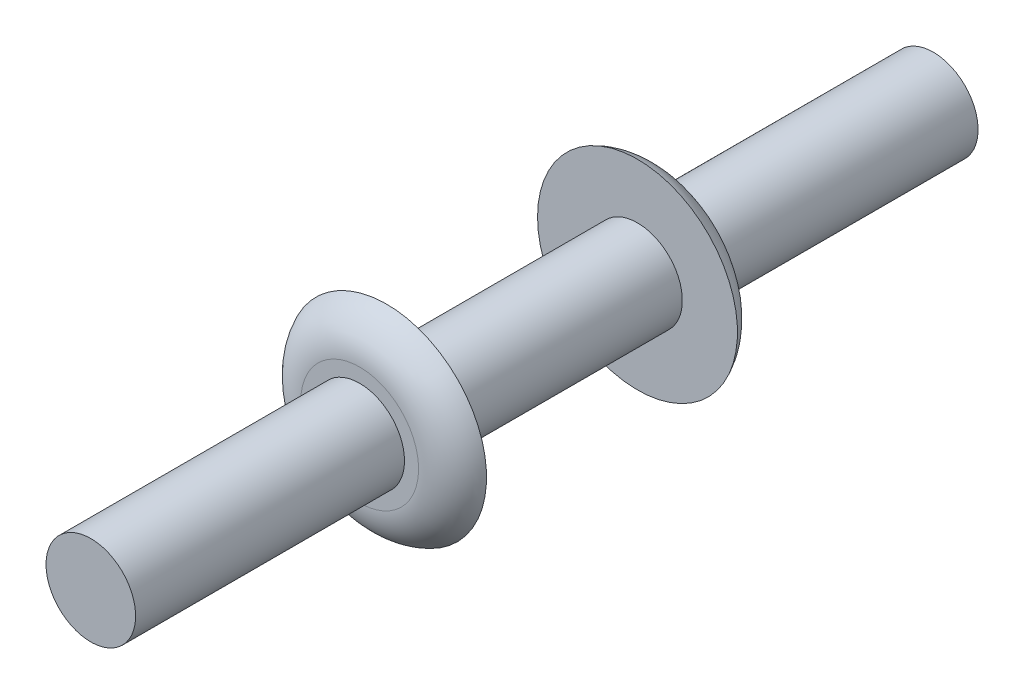
ISO-10303-21;
HEADER;
FILE_DESCRIPTION(('STEP AP214'),'2;1');
FILE_NAME('part.step','',(''),(''),'','','');
FILE_SCHEMA(('AUTOMOTIVE_DESIGN { 1 0 10303 214 1 1 1 1 }'));
ENDSEC;
DATA;
#1=APPLICATION_CONTEXT('core data for automotive mechanical design processes');
#2=APPLICATION_PROTOCOL_DEFINITION('international standard','automotive_design',2000,#1);
#3=PRODUCT_CONTEXT('',#1,'mechanical');
#4=PRODUCT('Part','Part','',(#3));
#5=PRODUCT_RELATED_PRODUCT_CATEGORY('part','',(#4));
#6=PRODUCT_DEFINITION_FORMATION('','',#4);
#7=PRODUCT_DEFINITION_CONTEXT('part definition',#1,'design');
#8=PRODUCT_DEFINITION('design','',#6,#7);
#9=PRODUCT_DEFINITION_SHAPE('','',#8);
#10=(LENGTH_UNIT() NAMED_UNIT(*) SI_UNIT(.MILLI.,.METRE.));
#11=(NAMED_UNIT(*) PLANE_ANGLE_UNIT() SI_UNIT($,.RADIAN.));
#12=(NAMED_UNIT(*) SI_UNIT($,.STERADIAN.) SOLID_ANGLE_UNIT());
#13=UNCERTAINTY_MEASURE_WITH_UNIT(LENGTH_MEASURE(1.E-05),#10,'distance_accuracy_value','');
#14=(GEOMETRIC_REPRESENTATION_CONTEXT(3) GLOBAL_UNCERTAINTY_ASSIGNED_CONTEXT((#13)) GLOBAL_UNIT_ASSIGNED_CONTEXT((#10,
#11,#12)) REPRESENTATION_CONTEXT('',''));
#15=CARTESIAN_POINT('',(0.,0.,0.));
#16=DIRECTION('',(0.,0.,1.));
#17=DIRECTION('',(1.,0.,0.));
#18=AXIS2_PLACEMENT_3D('',#15,#16,#17);
#19=CARTESIAN_POINT('',(-15.,0.,-209.43));
#20=DIRECTION('',(0.,0.,-1.));
#21=DIRECTION('',(-1.,0.,0.));
#22=AXIS2_PLACEMENT_3D('',#19,#20,#21);
#23=CYLINDRICAL_SURFACE('',#22,5.);
#24=CARTESIAN_POINT('',(-15.,0.,-245.43));
#25=DIRECTION('',(0.,0.,-1.));
#26=DIRECTION('',(-1.,0.,0.));
#27=AXIS2_PLACEMENT_3D('',#24,#25,#26);
#28=CIRCLE('',#27,5.);
#29=CARTESIAN_POINT('',(-20.,0.,-245.43));
#30=VERTEX_POINT('',#29);
#31=EDGE_CURVE('E56',#30,#30,#28,.T.);
#32=ORIENTED_EDGE('',*,*,#31,.F.);
#33=EDGE_LOOP('',(#32));
#34=FACE_BOUND('',#33,.T.);
#35=CARTESIAN_POINT('',(-15.,0.,-217.43));
#36=DIRECTION('',(0.,0.,1.));
#37=DIRECTION('',(1.,0.,0.));
#38=AXIS2_PLACEMENT_3D('',#35,#36,#37);
#39=CIRCLE('',#38,5.);
#40=CARTESIAN_POINT('',(-10.,0.,-217.43));
#41=VERTEX_POINT('',#40);
#42=EDGE_CURVE('E54',#41,#41,#39,.F.);
#43=ORIENTED_EDGE('',*,*,#42,.T.);
#44=EDGE_LOOP('',(#43));
#45=FACE_BOUND('',#44,.T.);
#46=ADVANCED_FACE('F35',(#34,#45),#23,.T.);
#47=CARTESIAN_POINT('',(-15.,0.,-248.43));
#48=DIRECTION('',(0.,0.,-1.));
#49=DIRECTION('',(-1.,0.,0.));
#50=AXIS2_PLACEMENT_3D('',#47,#48,#49);
#51=PLANE('',#50);
#52=CARTESIAN_POINT('',(-15.,0.,-248.43));
#53=DIRECTION('',(0.,0.,-1.));
#54=DIRECTION('',(-1.,0.,0.));
#55=AXIS2_PLACEMENT_3D('',#52,#53,#54);
#56=CIRCLE('',#55,5.);
#57=CARTESIAN_POINT('',(-20.,0.,-248.43));
#58=VERTEX_POINT('',#57);
#59=EDGE_CURVE('E61',#58,#58,#56,.T.);
#60=ORIENTED_EDGE('',*,*,#59,.F.);
#61=EDGE_LOOP('',(#60));
#62=FACE_BOUND('',#61,.T.);
#63=CARTESIAN_POINT('',(-15.,0.,-248.43));
#64=DIRECTION('',(0.,0.,-1.));
#65=DIRECTION('',(-1.,0.,0.));
#66=AXIS2_PLACEMENT_3D('',#63,#64,#65);
#67=CIRCLE('',#66,6.57134738170197);
#68=CARTESIAN_POINT('',(-21.571347381702,0.,-248.43));
#69=VERTEX_POINT('',#68);
#70=EDGE_CURVE('E42',#69,#69,#67,.T.);
#71=ORIENTED_EDGE('',*,*,#70,.T.);
#72=EDGE_LOOP('',(#71));
#73=FACE_BOUND('',#72,.T.);
#74=ADVANCED_FACE('F79',(#62,#73),#51,.T.);
#75=CARTESIAN_POINT('',(-15.,0.,-245.43));
#76=DIRECTION('',(0.,0.,-1.));
#77=DIRECTION('',(-1.,0.,0.));
#78=AXIS2_PLACEMENT_3D('',#75,#76,#77);
#79=PLANE('',#78);
#80=ORIENTED_EDGE('',*,*,#31,.T.);
#81=EDGE_LOOP('',(#80));
#82=FACE_BOUND('',#81,.T.);
#83=CARTESIAN_POINT('',(-15.,0.,-245.43));
#84=DIRECTION('',(0.,0.,-1.));
#85=DIRECTION('',(-1.,0.,0.));
#86=AXIS2_PLACEMENT_3D('',#83,#84,#85);
#87=CIRCLE('',#86,11.1539230766578);
#88=CARTESIAN_POINT('',(-26.1539230766578,0.,-245.43));
#89=VERTEX_POINT('',#88);
#90=EDGE_CURVE('E46',#89,#89,#87,.T.);
#91=ORIENTED_EDGE('',*,*,#90,.F.);
#92=EDGE_LOOP('',(#91));
#93=FACE_BOUND('',#92,.T.);
#94=ADVANCED_FACE('F81',(#82,#93),#79,.F.);
#95=CARTESIAN_POINT('',(-15.,0.,-243.43));
#96=DIRECTION('',(0.,0.,1.));
#97=DIRECTION('',(1.,0.,0.));
#98=AXIS2_PLACEMENT_3D('',#95,#96,#97);
#99=TOROIDAL_SURFACE('',#98,6.57134738170197,5.);
#100=ORIENTED_EDGE('',*,*,#90,.T.);
#101=EDGE_LOOP('',(#100));
#102=FACE_BOUND('',#101,.T.);
#103=ORIENTED_EDGE('',*,*,#70,.F.);
#104=EDGE_LOOP('',(#103));
#105=FACE_BOUND('',#104,.T.);
#106=ADVANCED_FACE('F37',(#102,#105),#99,.T.);
#107=CARTESIAN_POINT('',(-15.,0.,-278.43));
#108=DIRECTION('',(0.,0.,1.));
#109=DIRECTION('',(1.,0.,0.));
#110=AXIS2_PLACEMENT_3D('',#107,#108,#109);
#111=CYLINDRICAL_SURFACE('',#110,5.);
#112=CARTESIAN_POINT('',(-15.,0.,-278.43));
#113=DIRECTION('',(0.,0.,-1.));
#114=DIRECTION('',(-1.,0.,0.));
#115=AXIS2_PLACEMENT_3D('',#112,#113,#114);
#116=CIRCLE('',#115,5.);
#117=CARTESIAN_POINT('',(-20.,0.,-278.43));
#118=VERTEX_POINT('',#117);
#119=EDGE_CURVE('E51',#118,#118,#116,.T.);
#120=ORIENTED_EDGE('',*,*,#119,.F.);
#121=EDGE_LOOP('',(#120));
#122=FACE_BOUND('',#121,.T.);
#123=ORIENTED_EDGE('',*,*,#59,.T.);
#124=EDGE_LOOP('',(#123));
#125=FACE_BOUND('',#124,.T.);
#126=ADVANCED_FACE('F77',(#122,#125),#111,.T.);
#127=CARTESIAN_POINT('',(-15.,0.,-278.43));
#128=DIRECTION('',(0.,0.,-1.));
#129=DIRECTION('',(-1.,0.,0.));
#130=AXIS2_PLACEMENT_3D('',#127,#128,#129);
#131=PLANE('',#130);
#132=ORIENTED_EDGE('',*,*,#119,.T.);
#133=EDGE_LOOP('',(#132));
#134=FACE_BOUND('',#133,.T.);
#135=ADVANCED_FACE('F94',(#134),#131,.T.);
#136=CARTESIAN_POINT('',(-15.,0.,-214.43));
#137=DIRECTION('',(0.,0.,1.));
#138=DIRECTION('',(-1.,0.,0.));
#139=AXIS2_PLACEMENT_3D('',#136,#137,#138);
#140=PLANE('',#139);
#141=CARTESIAN_POINT('',(-15.,0.,-214.43));
#142=DIRECTION('',(0.,0.,1.));
#143=DIRECTION('',(1.,0.,0.));
#144=AXIS2_PLACEMENT_3D('',#141,#142,#143);
#145=CIRCLE('',#144,5.);
#146=CARTESIAN_POINT('',(-10.,0.,-214.43));
#147=VERTEX_POINT('',#146);
#148=EDGE_CURVE('E10',#147,#147,#145,.F.);
#149=ORIENTED_EDGE('',*,*,#148,.T.);
#150=EDGE_LOOP('',(#149));
#151=FACE_BOUND('',#150,.T.);
#152=CARTESIAN_POINT('',(-15.,0.,-214.43));
#153=DIRECTION('',(0.,0.,-1.));
#154=DIRECTION('',(-1.,0.,0.));
#155=AXIS2_PLACEMENT_3D('',#152,#153,#154);
#156=CIRCLE('',#155,6.57134738170197);
#157=CARTESIAN_POINT('',(-21.571347381702,0.,-214.43));
#158=VERTEX_POINT('',#157);
#159=EDGE_CURVE('E57',#158,#158,#156,.T.);
#160=ORIENTED_EDGE('',*,*,#159,.F.);
#161=EDGE_LOOP('',(#160));
#162=FACE_BOUND('',#161,.T.);
#163=ADVANCED_FACE('F97',(#151,#162),#140,.T.);
#164=CARTESIAN_POINT('',(-15.,0.,-217.43));
#165=DIRECTION('',(0.,0.,1.));
#166=DIRECTION('',(-1.,0.,0.));
#167=AXIS2_PLACEMENT_3D('',#164,#165,#166);
#168=PLANE('',#167);
#169=ORIENTED_EDGE('',*,*,#42,.F.);
#170=EDGE_LOOP('',(#169));
#171=FACE_BOUND('',#170,.T.);
#172=CARTESIAN_POINT('',(-15.,0.,-217.43));
#173=DIRECTION('',(0.,0.,-1.));
#174=DIRECTION('',(-1.,0.,0.));
#175=AXIS2_PLACEMENT_3D('',#172,#173,#174);
#176=CIRCLE('',#175,11.1539230766578);
#177=CARTESIAN_POINT('',(-26.1539230766578,0.,-217.43));
#178=VERTEX_POINT('',#177);
#179=EDGE_CURVE('E64',#178,#178,#176,.T.);
#180=ORIENTED_EDGE('',*,*,#179,.T.);
#181=EDGE_LOOP('',(#180));
#182=FACE_BOUND('',#181,.T.);
#183=ADVANCED_FACE('F106',(#171,#182),#168,.F.);
#184=CARTESIAN_POINT('',(-15.,0.,-219.43));
#185=DIRECTION('',(0.,0.,-1.));
#186=DIRECTION('',(1.,0.,0.));
#187=AXIS2_PLACEMENT_3D('',#184,#185,#186);
#188=TOROIDAL_SURFACE('',#187,6.57134738170197,5.);
#189=ORIENTED_EDGE('',*,*,#179,.F.);
#190=EDGE_LOOP('',(#189));
#191=FACE_BOUND('',#190,.T.);
#192=ORIENTED_EDGE('',*,*,#159,.T.);
#193=EDGE_LOOP('',(#192));
#194=FACE_BOUND('',#193,.T.);
#195=ADVANCED_FACE('F102',(#191,#194),#188,.T.);
#196=ORIENTED_EDGE('',*,*,#148,.F.);
#197=EDGE_LOOP('',(#196));
#198=FACE_BOUND('',#197,.T.);
#199=CARTESIAN_POINT('',(-15.,0.,-184.43));
#200=DIRECTION('',(0.,0.,-1.));
#201=DIRECTION('',(-1.,0.,0.));
#202=AXIS2_PLACEMENT_3D('',#199,#200,#201);
#203=CIRCLE('',#202,5.);
#204=CARTESIAN_POINT('',(-20.,0.,-184.43));
#205=VERTEX_POINT('',#204);
#206=EDGE_CURVE('E69',#205,#205,#203,.T.);
#207=ORIENTED_EDGE('',*,*,#206,.T.);
#208=EDGE_LOOP('',(#207));
#209=FACE_BOUND('',#208,.T.);
#210=ADVANCED_FACE('F90',(#198,#209),#23,.T.);
#211=CARTESIAN_POINT('',(-15.,0.,-184.43));
#212=DIRECTION('',(0.,0.,1.));
#213=DIRECTION('',(-1.,0.,0.));
#214=AXIS2_PLACEMENT_3D('',#211,#212,#213);
#215=PLANE('',#214);
#216=ORIENTED_EDGE('',*,*,#206,.F.);
#217=EDGE_LOOP('',(#216));
#218=FACE_BOUND('',#217,.T.);
#219=ADVANCED_FACE('F101',(#218),#215,.T.);
#220=CLOSED_SHELL('',(#46,#74,#94,#106,#126,#135,#163,#183,#195,#210,#219));
#221=MANIFOLD_SOLID_BREP('B2',#220);
#222=ADVANCED_BREP_SHAPE_REPRESENTATION('',(#18,#221),#14);
#223=SHAPE_DEFINITION_REPRESENTATION(#9,#222);
ENDSEC;
END-ISO-10303-21;
